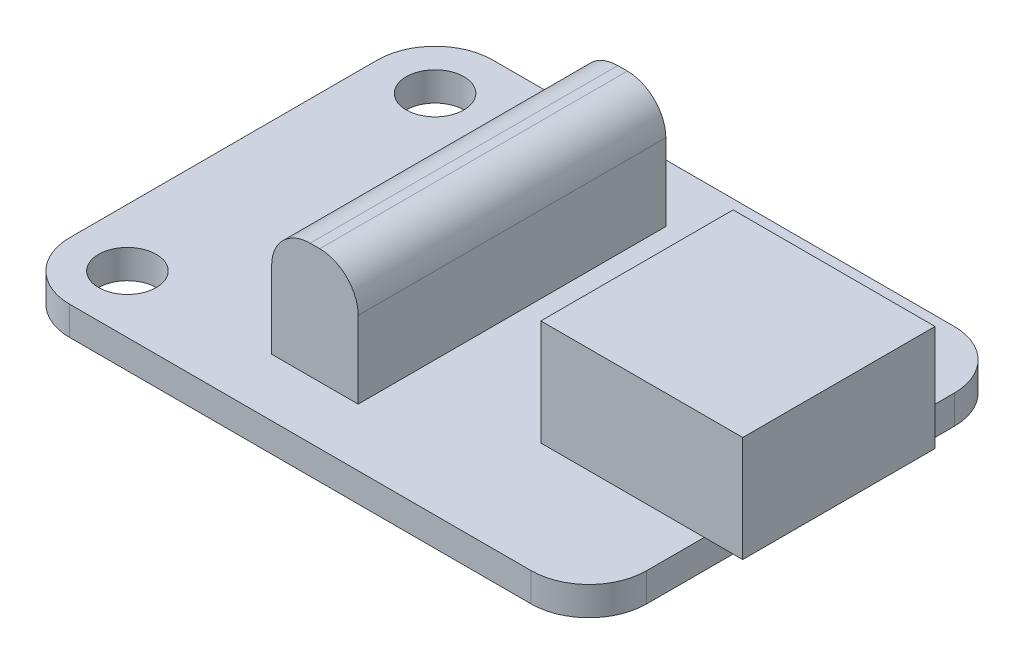
ISO-10303-21;
HEADER;
FILE_DESCRIPTION(('STEP AP214'),'2;1');
FILE_NAME('part.step','',(''),(''),'','','');
FILE_SCHEMA(('AUTOMOTIVE_DESIGN { 1 0 10303 214 1 1 1 1 }'));
ENDSEC;
DATA;
#1=APPLICATION_CONTEXT('core data for automotive mechanical design processes');
#2=APPLICATION_PROTOCOL_DEFINITION('international standard','automotive_design',2000,#1);
#3=PRODUCT_CONTEXT('',#1,'mechanical');
#4=PRODUCT('Part','Part','',(#3));
#5=PRODUCT_RELATED_PRODUCT_CATEGORY('part','',(#4));
#6=PRODUCT_DEFINITION_FORMATION('','',#4);
#7=PRODUCT_DEFINITION_CONTEXT('part definition',#1,'design');
#8=PRODUCT_DEFINITION('design','',#6,#7);
#9=PRODUCT_DEFINITION_SHAPE('','',#8);
#10=(LENGTH_UNIT() NAMED_UNIT(*) SI_UNIT(.MILLI.,.METRE.));
#11=(NAMED_UNIT(*) PLANE_ANGLE_UNIT() SI_UNIT($,.RADIAN.));
#12=(NAMED_UNIT(*) SI_UNIT($,.STERADIAN.) SOLID_ANGLE_UNIT());
#13=UNCERTAINTY_MEASURE_WITH_UNIT(LENGTH_MEASURE(1.E-05),#10,'distance_accuracy_value','');
#14=(GEOMETRIC_REPRESENTATION_CONTEXT(3) GLOBAL_UNCERTAINTY_ASSIGNED_CONTEXT((#13)) GLOBAL_UNIT_ASSIGNED_CONTEXT((#10,
#11,#12)) REPRESENTATION_CONTEXT('',''));
#15=CARTESIAN_POINT('',(0.,0.,0.));
#16=DIRECTION('',(0.,0.,1.));
#17=DIRECTION('',(1.,0.,0.));
#18=AXIS2_PLACEMENT_3D('',#15,#16,#17);
#19=CARTESIAN_POINT('',(-1.19831368631368,1.5,13.1654125874126));
#20=DIRECTION('',(0.,-1.,0.));
#21=DIRECTION('',(0.,0.,-1.));
#22=AXIS2_PLACEMENT_3D('',#19,#20,#21);
#23=PLANE('',#22);
#24=DIRECTION('',(-1.,0.,0.));
#25=VECTOR('',#24,1.);
#26=CARTESIAN_POINT('',(1.80168631368632,1.5,0.165412587412595));
#27=LINE('',#26,#25);
#28=CARTESIAN_POINT('',(1.80168631368632,1.5,0.165412587412596));
#29=VERTEX_POINT('',#28);
#30=CARTESIAN_POINT('',(-6.69831368631368,1.5,0.165412587412596));
#31=VERTEX_POINT('',#30);
#32=EDGE_CURVE('E211',#29,#31,#27,.T.);
#33=ORIENTED_EDGE('',*,*,#32,.F.);
#34=DIRECTION('',(0.,0.,-1.));
#35=VECTOR('',#34,1.);
#36=CARTESIAN_POINT('',(1.80168631368632,1.5,-2.83458741258738));
#37=LINE('',#36,#35);
#38=CARTESIAN_POINT('',(1.80168631368632,1.5,-2.83458741258738));
#39=VERTEX_POINT('',#38);
#40=EDGE_CURVE('E247',#29,#39,#37,.T.);
#41=ORIENTED_EDGE('',*,*,#40,.T.);
#42=CARTESIAN_POINT('',(-1.19831368631368,1.5,-2.8345874125874));
#43=DIRECTION('',(0.,1.,0.));
#44=DIRECTION('',(0.,0.,1.));
#45=AXIS2_PLACEMENT_3D('',#42,#43,#44);
#46=CIRCLE('',#45,3.);
#47=CARTESIAN_POINT('',(-1.1983136863137,1.5,-5.8345874125874));
#48=VERTEX_POINT('',#47);
#49=EDGE_CURVE('E252',#39,#48,#46,.T.);
#50=ORIENTED_EDGE('',*,*,#49,.T.);
#51=DIRECTION('',(-1.,0.,0.));
#52=VECTOR('',#51,1.);
#53=CARTESIAN_POINT('',(-25.1983136863137,1.5,-5.8345874125874));
#54=LINE('',#53,#52);
#55=CARTESIAN_POINT('',(-25.1983136863137,1.5,-5.8345874125874));
#56=VERTEX_POINT('',#55);
#57=EDGE_CURVE('E255',#48,#56,#54,.T.);
#58=ORIENTED_EDGE('',*,*,#57,.T.);
#59=CARTESIAN_POINT('',(-25.1983136863137,1.5,-2.8345874125874));
#60=DIRECTION('',(0.,1.,0.));
#61=DIRECTION('',(0.,0.,1.));
#62=AXIS2_PLACEMENT_3D('',#59,#60,#61);
#63=CIRCLE('',#62,3.);
#64=CARTESIAN_POINT('',(-28.1983136863137,1.5,-2.83458741258738));
#65=VERTEX_POINT('',#64);
#66=EDGE_CURVE('E257',#56,#65,#63,.T.);
#67=ORIENTED_EDGE('',*,*,#66,.T.);
#68=DIRECTION('',(0.,0.,1.));
#69=VECTOR('',#68,1.);
#70=CARTESIAN_POINT('',(-28.1983136863137,1.5,-2.83458741258738));
#71=LINE('',#70,#69);
#72=CARTESIAN_POINT('',(-28.1983136863137,1.5,13.1654125874126));
#73=VERTEX_POINT('',#72);
#74=EDGE_CURVE('E259',#65,#73,#71,.T.);
#75=ORIENTED_EDGE('',*,*,#74,.T.);
#76=CARTESIAN_POINT('',(-25.1983136863137,1.5,13.1654125874126));
#77=DIRECTION('',(0.,1.,0.));
#78=DIRECTION('',(0.,0.,-1.));
#79=AXIS2_PLACEMENT_3D('',#76,#77,#78);
#80=CIRCLE('',#79,3.);
#81=CARTESIAN_POINT('',(-25.1983136863137,1.5,16.1654125874126));
#82=VERTEX_POINT('',#81);
#83=EDGE_CURVE('E261',#73,#82,#80,.T.);
#84=ORIENTED_EDGE('',*,*,#83,.T.);
#85=DIRECTION('',(1.,0.,0.));
#86=VECTOR('',#85,1.);
#87=CARTESIAN_POINT('',(-1.1983136863137,1.5,16.1654125874126));
#88=LINE('',#87,#86);
#89=CARTESIAN_POINT('',(-1.1983136863137,1.5,16.1654125874126));
#90=VERTEX_POINT('',#89);
#91=EDGE_CURVE('E263',#82,#90,#88,.T.);
#92=ORIENTED_EDGE('',*,*,#91,.T.);
#93=CARTESIAN_POINT('',(-1.19831368631368,1.5,13.1654125874126));
#94=DIRECTION('',(0.,1.,0.));
#95=DIRECTION('',(0.,0.,-1.));
#96=AXIS2_PLACEMENT_3D('',#93,#94,#95);
#97=CIRCLE('',#96,3.);
#98=CARTESIAN_POINT('',(1.80168631368632,1.5,13.1654125874126));
#99=VERTEX_POINT('',#98);
#100=EDGE_CURVE('E244',#90,#99,#97,.T.);
#101=ORIENTED_EDGE('',*,*,#100,.T.);
#102=CARTESIAN_POINT('',(1.80168631368632,1.5,10.1654125874126));
#103=VERTEX_POINT('',#102);
#104=EDGE_CURVE('E249',#99,#103,#37,.T.);
#105=ORIENTED_EDGE('',*,*,#104,.T.);
#106=DIRECTION('',(1.,0.,0.));
#107=VECTOR('',#106,1.);
#108=CARTESIAN_POINT('',(1.80168631368632,1.5,10.1654125874126));
#109=LINE('',#108,#107);
#110=CARTESIAN_POINT('',(-6.69831368631368,1.5,10.1654125874126));
#111=VERTEX_POINT('',#110);
#112=EDGE_CURVE('E215',#111,#103,#109,.T.);
#113=ORIENTED_EDGE('',*,*,#112,.F.);
#114=DIRECTION('',(0.,0.,1.));
#115=VECTOR('',#114,1.);
#116=CARTESIAN_POINT('',(-6.69831368631368,1.5,0.165412587412596));
#117=LINE('',#116,#115);
#118=EDGE_CURVE('E210',#31,#111,#117,.T.);
#119=ORIENTED_EDGE('',*,*,#118,.F.);
#120=EDGE_LOOP('',(#33,#41,#50,#58,#67,#75,#84,#92,#101,#105,#113,#119));
#121=FACE_BOUND('',#120,.T.);
#122=CARTESIAN_POINT('',(-25.1983136863137,1.5,13.1654125874126));
#123=DIRECTION('',(0.,1.,0.));
#124=DIRECTION('',(0.,0.,1.));
#125=AXIS2_PLACEMENT_3D('',#122,#123,#124);
#126=CIRCLE('',#125,1.5);
#127=CARTESIAN_POINT('',(-25.1983136863137,1.5,14.6654125874126));
#128=VERTEX_POINT('',#127);
#129=EDGE_CURVE('E238',#128,#128,#126,.T.);
#130=ORIENTED_EDGE('',*,*,#129,.F.);
#131=EDGE_LOOP('',(#130));
#132=FACE_BOUND('',#131,.T.);
#133=CARTESIAN_POINT('',(-25.1983136863137,1.5,-2.8345874125874));
#134=DIRECTION('',(0.,1.,0.));
#135=DIRECTION('',(0.,0.,1.));
#136=AXIS2_PLACEMENT_3D('',#133,#134,#135);
#137=CIRCLE('',#136,1.5);
#138=CARTESIAN_POINT('',(-25.1983136863137,1.5,-1.3345874125874));
#139=VERTEX_POINT('',#138);
#140=EDGE_CURVE('E232',#139,#139,#137,.T.);
#141=ORIENTED_EDGE('',*,*,#140,.F.);
#142=EDGE_LOOP('',(#141));
#143=FACE_BOUND('',#142,.T.);
#144=DIRECTION('',(-1.,0.,0.));
#145=VECTOR('',#144,1.);
#146=CARTESIAN_POINT('',(-13.1983136863137,1.5,-2.8345874125874));
#147=LINE('',#146,#145);
#148=CARTESIAN_POINT('',(-13.1983136863137,1.5,-2.8345874125874));
#149=VERTEX_POINT('',#148);
#150=CARTESIAN_POINT('',(-17.6983136863137,1.5,-2.8345874125874));
#151=VERTEX_POINT('',#150);
#152=EDGE_CURVE('E166',#149,#151,#147,.T.);
#153=ORIENTED_EDGE('',*,*,#152,.F.);
#154=DIRECTION('',(0.,0.,-1.));
#155=VECTOR('',#154,1.);
#156=CARTESIAN_POINT('',(-13.1983136863137,1.5,13.1654125874126));
#157=LINE('',#156,#155);
#158=CARTESIAN_POINT('',(-13.1983136863137,1.5,13.1654125874126));
#159=VERTEX_POINT('',#158);
#160=EDGE_CURVE('E177',#159,#149,#157,.T.);
#161=ORIENTED_EDGE('',*,*,#160,.F.);
#162=DIRECTION('',(1.,0.,0.));
#163=VECTOR('',#162,1.);
#164=CARTESIAN_POINT('',(-17.6983136863137,1.5,13.1654125874126));
#165=LINE('',#164,#163);
#166=CARTESIAN_POINT('',(-17.6983136863137,1.5,13.1654125874126));
#167=VERTEX_POINT('',#166);
#168=EDGE_CURVE('E185',#167,#159,#165,.T.);
#169=ORIENTED_EDGE('',*,*,#168,.F.);
#170=DIRECTION('',(0.,0.,1.));
#171=VECTOR('',#170,1.);
#172=CARTESIAN_POINT('',(-17.6983136863137,1.5,-2.8345874125874));
#173=LINE('',#172,#171);
#174=EDGE_CURVE('E180',#151,#167,#173,.T.);
#175=ORIENTED_EDGE('',*,*,#174,.F.);
#176=EDGE_LOOP('',(#153,#161,#169,#175));
#177=FACE_BOUND('',#176,.T.);
#178=ADVANCED_FACE('F34',(#121,#132,#143,#177),#23,.F.);
#179=CARTESIAN_POINT('',(-1.19831368631368,0.,13.1654125874126));
#180=DIRECTION('',(0.,-1.,0.));
#181=DIRECTION('',(0.,0.,-1.));
#182=AXIS2_PLACEMENT_3D('',#179,#180,#181);
#183=PLANE('',#182);
#184=CARTESIAN_POINT('',(-25.1983136863137,0.,13.1654125874126));
#185=DIRECTION('',(0.,1.,0.));
#186=DIRECTION('',(0.,0.,1.));
#187=AXIS2_PLACEMENT_3D('',#184,#185,#186);
#188=CIRCLE('',#187,1.5);
#189=CARTESIAN_POINT('',(-25.1983136863137,0.,14.6654125874126));
#190=VERTEX_POINT('',#189);
#191=EDGE_CURVE('E235',#190,#190,#188,.T.);
#192=ORIENTED_EDGE('',*,*,#191,.T.);
#193=EDGE_LOOP('',(#192));
#194=FACE_BOUND('',#193,.T.);
#195=CARTESIAN_POINT('',(-1.19831368631368,0.,13.1654125874126));
#196=DIRECTION('',(0.,1.,0.));
#197=DIRECTION('',(0.,0.,-1.));
#198=AXIS2_PLACEMENT_3D('',#195,#196,#197);
#199=CIRCLE('',#198,3.);
#200=CARTESIAN_POINT('',(-1.1983136863137,0.,16.1654125874126));
#201=VERTEX_POINT('',#200);
#202=CARTESIAN_POINT('',(1.80168631368632,0.,13.1654125874126));
#203=VERTEX_POINT('',#202);
#204=EDGE_CURVE('E241',#201,#203,#199,.T.);
#205=ORIENTED_EDGE('',*,*,#204,.F.);
#206=DIRECTION('',(1.,0.,0.));
#207=VECTOR('',#206,1.);
#208=CARTESIAN_POINT('',(-1.1983136863137,0.,16.1654125874126));
#209=LINE('',#208,#207);
#210=CARTESIAN_POINT('',(-25.1983136863137,0.,16.1654125874126));
#211=VERTEX_POINT('',#210);
#212=EDGE_CURVE('E248',#211,#201,#209,.T.);
#213=ORIENTED_EDGE('',*,*,#212,.F.);
#214=CARTESIAN_POINT('',(-25.1983136863137,0.,13.1654125874126));
#215=DIRECTION('',(0.,1.,0.));
#216=DIRECTION('',(0.,0.,-1.));
#217=AXIS2_PLACEMENT_3D('',#214,#215,#216);
#218=CIRCLE('',#217,3.);
#219=CARTESIAN_POINT('',(-28.1983136863137,0.,13.1654125874126));
#220=VERTEX_POINT('',#219);
#221=EDGE_CURVE('E278',#220,#211,#218,.T.);
#222=ORIENTED_EDGE('',*,*,#221,.F.);
#223=DIRECTION('',(0.,0.,1.));
#224=VECTOR('',#223,1.);
#225=CARTESIAN_POINT('',(-28.1983136863137,0.,-2.83458741258738));
#226=LINE('',#225,#224);
#227=CARTESIAN_POINT('',(-28.1983136863137,0.,-2.83458741258738));
#228=VERTEX_POINT('',#227);
#229=EDGE_CURVE('E276',#228,#220,#226,.T.);
#230=ORIENTED_EDGE('',*,*,#229,.F.);
#231=CARTESIAN_POINT('',(-25.1983136863137,0.,-2.8345874125874));
#232=DIRECTION('',(0.,1.,0.));
#233=DIRECTION('',(0.,0.,1.));
#234=AXIS2_PLACEMENT_3D('',#231,#232,#233);
#235=CIRCLE('',#234,3.);
#236=CARTESIAN_POINT('',(-25.1983136863137,0.,-5.8345874125874));
#237=VERTEX_POINT('',#236);
#238=EDGE_CURVE('E274',#237,#228,#235,.T.);
#239=ORIENTED_EDGE('',*,*,#238,.F.);
#240=DIRECTION('',(-1.,0.,0.));
#241=VECTOR('',#240,1.);
#242=CARTESIAN_POINT('',(-25.1983136863137,0.,-5.8345874125874));
#243=LINE('',#242,#241);
#244=CARTESIAN_POINT('',(-1.1983136863137,0.,-5.8345874125874));
#245=VERTEX_POINT('',#244);
#246=EDGE_CURVE('E272',#245,#237,#243,.T.);
#247=ORIENTED_EDGE('',*,*,#246,.F.);
#248=CARTESIAN_POINT('',(-1.19831368631368,0.,-2.8345874125874));
#249=DIRECTION('',(0.,1.,0.));
#250=DIRECTION('',(0.,0.,1.));
#251=AXIS2_PLACEMENT_3D('',#248,#249,#250);
#252=CIRCLE('',#251,3.);
#253=CARTESIAN_POINT('',(1.80168631368632,0.,-2.83458741258738));
#254=VERTEX_POINT('',#253);
#255=EDGE_CURVE('E270',#254,#245,#252,.T.);
#256=ORIENTED_EDGE('',*,*,#255,.F.);
#257=DIRECTION('',(0.,0.,-1.));
#258=VECTOR('',#257,1.);
#259=CARTESIAN_POINT('',(1.80168631368632,0.,-2.83458741258738));
#260=LINE('',#259,#258);
#261=EDGE_CURVE('E268',#203,#254,#260,.T.);
#262=ORIENTED_EDGE('',*,*,#261,.F.);
#263=EDGE_LOOP('',(#205,#213,#222,#230,#239,#247,#256,#262));
#264=FACE_BOUND('',#263,.T.);
#265=CARTESIAN_POINT('',(-25.1983136863137,0.,-2.8345874125874));
#266=DIRECTION('',(0.,1.,0.));
#267=DIRECTION('',(0.,0.,1.));
#268=AXIS2_PLACEMENT_3D('',#265,#266,#267);
#269=CIRCLE('',#268,1.5);
#270=CARTESIAN_POINT('',(-25.1983136863137,0.,-1.3345874125874));
#271=VERTEX_POINT('',#270);
#272=EDGE_CURVE('E231',#271,#271,#269,.T.);
#273=ORIENTED_EDGE('',*,*,#272,.T.);
#274=EDGE_LOOP('',(#273));
#275=FACE_BOUND('',#274,.T.);
#276=ADVANCED_FACE('F335',(#194,#264,#275),#183,.T.);
#277=CARTESIAN_POINT('',(-1.19831368631368,1.5,13.1654125874126));
#278=DIRECTION('',(0.,-1.,0.));
#279=DIRECTION('',(0.,0.,-1.));
#280=AXIS2_PLACEMENT_3D('',#277,#278,#279);
#281=CYLINDRICAL_SURFACE('',#280,3.);
#282=ORIENTED_EDGE('',*,*,#204,.T.);
#283=DIRECTION('',(0.,-1.,0.));
#284=VECTOR('',#283,1.);
#285=CARTESIAN_POINT('',(1.80168631368632,1.5,13.1654125874126));
#286=LINE('',#285,#284);
#287=EDGE_CURVE('E301',#99,#203,#286,.T.);
#288=ORIENTED_EDGE('',*,*,#287,.F.);
#289=ORIENTED_EDGE('',*,*,#100,.F.);
#290=DIRECTION('',(0.,-1.,0.));
#291=VECTOR('',#290,1.);
#292=CARTESIAN_POINT('',(-1.1983136863137,1.5,16.1654125874126));
#293=LINE('',#292,#291);
#294=EDGE_CURVE('E265',#90,#201,#293,.T.);
#295=ORIENTED_EDGE('',*,*,#294,.T.);
#296=EDGE_LOOP('',(#282,#288,#289,#295));
#297=FACE_BOUND('',#296,.T.);
#298=ADVANCED_FACE('F341',(#297),#281,.T.);
#299=CARTESIAN_POINT('',(1.80168631368632,1.5,-2.83458741258738));
#300=DIRECTION('',(-1.,0.,0.));
#301=DIRECTION('',(0.,0.,1.));
#302=AXIS2_PLACEMENT_3D('',#299,#300,#301);
#303=PLANE('',#302);
#304=ORIENTED_EDGE('',*,*,#261,.T.);
#305=DIRECTION('',(0.,-1.,0.));
#306=VECTOR('',#305,1.);
#307=CARTESIAN_POINT('',(1.80168631368632,1.5,-2.83458741258738));
#308=LINE('',#307,#306);
#309=EDGE_CURVE('E298',#39,#254,#308,.T.);
#310=ORIENTED_EDGE('',*,*,#309,.F.);
#311=ORIENTED_EDGE('',*,*,#40,.F.);
#312=EDGE_CURVE('E253',#103,#29,#37,.T.);
#313=ORIENTED_EDGE('',*,*,#312,.F.);
#314=ORIENTED_EDGE('',*,*,#104,.F.);
#315=ORIENTED_EDGE('',*,*,#287,.T.);
#316=EDGE_LOOP('',(#304,#310,#311,#313,#314,#315));
#317=FACE_BOUND('',#316,.T.);
#318=ADVANCED_FACE('F372',(#317),#303,.F.);
#319=CARTESIAN_POINT('',(-1.19831368631368,1.5,-2.8345874125874));
#320=DIRECTION('',(0.,-1.,0.));
#321=DIRECTION('',(0.,0.,-1.));
#322=AXIS2_PLACEMENT_3D('',#319,#320,#321);
#323=CYLINDRICAL_SURFACE('',#322,3.);
#324=ORIENTED_EDGE('',*,*,#255,.T.);
#325=DIRECTION('',(0.,-1.,0.));
#326=VECTOR('',#325,1.);
#327=CARTESIAN_POINT('',(-1.1983136863137,1.5,-5.8345874125874));
#328=LINE('',#327,#326);
#329=EDGE_CURVE('E295',#48,#245,#328,.T.);
#330=ORIENTED_EDGE('',*,*,#329,.F.);
#331=ORIENTED_EDGE('',*,*,#49,.F.);
#332=ORIENTED_EDGE('',*,*,#309,.T.);
#333=EDGE_LOOP('',(#324,#330,#331,#332));
#334=FACE_BOUND('',#333,.T.);
#335=ADVANCED_FACE('F368',(#334),#323,.T.);
#336=CARTESIAN_POINT('',(-25.1983136863137,1.5,-5.8345874125874));
#337=DIRECTION('',(0.,0.,1.));
#338=DIRECTION('',(1.,0.,0.));
#339=AXIS2_PLACEMENT_3D('',#336,#337,#338);
#340=PLANE('',#339);
#341=ORIENTED_EDGE('',*,*,#246,.T.);
#342=DIRECTION('',(0.,-1.,0.));
#343=VECTOR('',#342,1.);
#344=CARTESIAN_POINT('',(-25.1983136863137,1.5,-5.8345874125874));
#345=LINE('',#344,#343);
#346=EDGE_CURVE('E292',#56,#237,#345,.T.);
#347=ORIENTED_EDGE('',*,*,#346,.F.);
#348=ORIENTED_EDGE('',*,*,#57,.F.);
#349=ORIENTED_EDGE('',*,*,#329,.T.);
#350=EDGE_LOOP('',(#341,#347,#348,#349));
#351=FACE_BOUND('',#350,.T.);
#352=ADVANCED_FACE('F364',(#351),#340,.F.);
#353=CARTESIAN_POINT('',(-25.1983136863137,1.5,-2.8345874125874));
#354=DIRECTION('',(0.,-1.,0.));
#355=DIRECTION('',(0.,0.,-1.));
#356=AXIS2_PLACEMENT_3D('',#353,#354,#355);
#357=CYLINDRICAL_SURFACE('',#356,3.);
#358=ORIENTED_EDGE('',*,*,#238,.T.);
#359=DIRECTION('',(0.,-1.,0.));
#360=VECTOR('',#359,1.);
#361=CARTESIAN_POINT('',(-28.1983136863137,1.5,-2.83458741258738));
#362=LINE('',#361,#360);
#363=EDGE_CURVE('E289',#65,#228,#362,.T.);
#364=ORIENTED_EDGE('',*,*,#363,.F.);
#365=ORIENTED_EDGE('',*,*,#66,.F.);
#366=ORIENTED_EDGE('',*,*,#346,.T.);
#367=EDGE_LOOP('',(#358,#364,#365,#366));
#368=FACE_BOUND('',#367,.T.);
#369=ADVANCED_FACE('F360',(#368),#357,.T.);
#370=CARTESIAN_POINT('',(-28.1983136863137,1.5,-2.83458741258738));
#371=DIRECTION('',(1.,0.,0.));
#372=DIRECTION('',(0.,0.,-1.));
#373=AXIS2_PLACEMENT_3D('',#370,#371,#372);
#374=PLANE('',#373);
#375=ORIENTED_EDGE('',*,*,#229,.T.);
#376=DIRECTION('',(0.,-1.,0.));
#377=VECTOR('',#376,1.);
#378=CARTESIAN_POINT('',(-28.1983136863137,1.5,13.1654125874126));
#379=LINE('',#378,#377);
#380=EDGE_CURVE('E286',#73,#220,#379,.T.);
#381=ORIENTED_EDGE('',*,*,#380,.F.);
#382=ORIENTED_EDGE('',*,*,#74,.F.);
#383=ORIENTED_EDGE('',*,*,#363,.T.);
#384=EDGE_LOOP('',(#375,#381,#382,#383));
#385=FACE_BOUND('',#384,.T.);
#386=ADVANCED_FACE('F356',(#385),#374,.F.);
#387=CARTESIAN_POINT('',(-25.1983136863137,1.5,13.1654125874126));
#388=DIRECTION('',(0.,-1.,0.));
#389=DIRECTION('',(0.,0.,-1.));
#390=AXIS2_PLACEMENT_3D('',#387,#388,#389);
#391=CYLINDRICAL_SURFACE('',#390,3.);
#392=ORIENTED_EDGE('',*,*,#221,.T.);
#393=DIRECTION('',(0.,-1.,0.));
#394=VECTOR('',#393,1.);
#395=CARTESIAN_POINT('',(-25.1983136863137,1.5,16.1654125874126));
#396=LINE('',#395,#394);
#397=EDGE_CURVE('E283',#82,#211,#396,.T.);
#398=ORIENTED_EDGE('',*,*,#397,.F.);
#399=ORIENTED_EDGE('',*,*,#83,.F.);
#400=ORIENTED_EDGE('',*,*,#380,.T.);
#401=EDGE_LOOP('',(#392,#398,#399,#400));
#402=FACE_BOUND('',#401,.T.);
#403=ADVANCED_FACE('F352',(#402),#391,.T.);
#404=CARTESIAN_POINT('',(-1.1983136863137,1.5,16.1654125874126));
#405=DIRECTION('',(0.,0.,-1.));
#406=DIRECTION('',(-1.,0.,0.));
#407=AXIS2_PLACEMENT_3D('',#404,#405,#406);
#408=PLANE('',#407);
#409=ORIENTED_EDGE('',*,*,#212,.T.);
#410=ORIENTED_EDGE('',*,*,#294,.F.);
#411=ORIENTED_EDGE('',*,*,#91,.F.);
#412=ORIENTED_EDGE('',*,*,#397,.T.);
#413=EDGE_LOOP('',(#409,#410,#411,#412));
#414=FACE_BOUND('',#413,.T.);
#415=ADVANCED_FACE('F349',(#414),#408,.F.);
#416=CARTESIAN_POINT('',(-25.1983136863137,1.5,13.1654125874126));
#417=DIRECTION('',(0.,-1.,0.));
#418=DIRECTION('',(0.,0.,-1.));
#419=AXIS2_PLACEMENT_3D('',#416,#417,#418);
#420=CYLINDRICAL_SURFACE('',#419,1.5);
#421=ORIENTED_EDGE('',*,*,#129,.T.);
#422=EDGE_LOOP('',(#421));
#423=FACE_BOUND('',#422,.T.);
#424=ORIENTED_EDGE('',*,*,#191,.F.);
#425=EDGE_LOOP('',(#424));
#426=FACE_BOUND('',#425,.T.);
#427=ADVANCED_FACE('F346',(#423,#426),#420,.F.);
#428=CARTESIAN_POINT('',(-25.1983136863137,1.5,-2.8345874125874));
#429=DIRECTION('',(0.,-1.,0.));
#430=DIRECTION('',(0.,0.,-1.));
#431=AXIS2_PLACEMENT_3D('',#428,#429,#430);
#432=CYLINDRICAL_SURFACE('',#431,1.5);
#433=ORIENTED_EDGE('',*,*,#140,.T.);
#434=EDGE_LOOP('',(#433));
#435=FACE_BOUND('',#434,.T.);
#436=ORIENTED_EDGE('',*,*,#272,.F.);
#437=EDGE_LOOP('',(#436));
#438=FACE_BOUND('',#437,.T.);
#439=ADVANCED_FACE('F441',(#435,#438),#432,.F.);
#440=CARTESIAN_POINT('',(0.,1.5,0.));
#441=DIRECTION('',(0.,1.,0.));
#442=DIRECTION('',(0.,0.,1.));
#443=AXIS2_PLACEMENT_3D('',#440,#441,#442);
#444=PLANE('',#443);
#445=CARTESIAN_POINT('',(3.80168631368632,1.5,10.1654125874126));
#446=VERTEX_POINT('',#445);
#447=EDGE_CURVE('E214',#103,#446,#109,.T.);
#448=ORIENTED_EDGE('',*,*,#447,.F.);
#449=ORIENTED_EDGE('',*,*,#312,.T.);
#450=CARTESIAN_POINT('',(3.80168631368632,1.5,0.165412587412595));
#451=VERTEX_POINT('',#450);
#452=EDGE_CURVE('E197',#451,#29,#27,.T.);
#453=ORIENTED_EDGE('',*,*,#452,.F.);
#454=DIRECTION('',(0.,0.,-1.));
#455=VECTOR('',#454,1.);
#456=CARTESIAN_POINT('',(3.80168631368632,1.5,10.1654125874126));
#457=LINE('',#456,#455);
#458=EDGE_CURVE('E201',#446,#451,#457,.T.);
#459=ORIENTED_EDGE('',*,*,#458,.F.);
#460=EDGE_LOOP('',(#448,#449,#453,#459));
#461=FACE_BOUND('',#460,.T.);
#462=ADVANCED_FACE('F409',(#461),#444,.F.);
#463=CARTESIAN_POINT('',(1.80168631368632,7.,0.165412587412595));
#464=DIRECTION('',(0.,0.,1.));
#465=DIRECTION('',(1.,0.,0.));
#466=AXIS2_PLACEMENT_3D('',#463,#464,#465);
#467=PLANE('',#466);
#468=ORIENTED_EDGE('',*,*,#452,.T.);
#469=ORIENTED_EDGE('',*,*,#32,.T.);
#470=DIRECTION('',(0.,-1.,0.));
#471=VECTOR('',#470,1.);
#472=CARTESIAN_POINT('',(-6.69831368631368,7.,0.165412587412596));
#473=LINE('',#472,#471);
#474=CARTESIAN_POINT('',(-6.69831368631368,7.,0.165412587412596));
#475=VERTEX_POINT('',#474);
#476=EDGE_CURVE('E228',#475,#31,#473,.T.);
#477=ORIENTED_EDGE('',*,*,#476,.F.);
#478=DIRECTION('',(-1.,0.,0.));
#479=VECTOR('',#478,1.);
#480=CARTESIAN_POINT('',(3.80168631368632,7.,0.165412587412595));
#481=LINE('',#480,#479);
#482=CARTESIAN_POINT('',(3.80168631368632,7.,0.165412587412595));
#483=VERTEX_POINT('',#482);
#484=EDGE_CURVE('E198',#483,#475,#481,.T.);
#485=ORIENTED_EDGE('',*,*,#484,.F.);
#486=DIRECTION('',(0.,-1.,0.));
#487=VECTOR('',#486,1.);
#488=CARTESIAN_POINT('',(3.80168631368632,7.,0.165412587412595));
#489=LINE('',#488,#487);
#490=EDGE_CURVE('E207',#483,#451,#489,.T.);
#491=ORIENTED_EDGE('',*,*,#490,.T.);
#492=EDGE_LOOP('',(#468,#469,#477,#485,#491));
#493=FACE_BOUND('',#492,.T.);
#494=ADVANCED_FACE('F413',(#493),#467,.F.);
#495=CARTESIAN_POINT('',(-6.69831368631368,7.,0.165412587412596));
#496=DIRECTION('',(1.,0.,0.));
#497=DIRECTION('',(0.,0.,-1.));
#498=AXIS2_PLACEMENT_3D('',#495,#496,#497);
#499=PLANE('',#498);
#500=ORIENTED_EDGE('',*,*,#118,.T.);
#501=DIRECTION('',(0.,-1.,0.));
#502=VECTOR('',#501,1.);
#503=CARTESIAN_POINT('',(-6.69831368631368,7.,10.1654125874126));
#504=LINE('',#503,#502);
#505=CARTESIAN_POINT('',(-6.69831368631368,7.,10.1654125874126));
#506=VERTEX_POINT('',#505);
#507=EDGE_CURVE('E225',#506,#111,#504,.T.);
#508=ORIENTED_EDGE('',*,*,#507,.F.);
#509=DIRECTION('',(0.,0.,1.));
#510=VECTOR('',#509,1.);
#511=CARTESIAN_POINT('',(-6.69831368631368,7.,0.165412587412596));
#512=LINE('',#511,#510);
#513=EDGE_CURVE('E200',#475,#506,#512,.T.);
#514=ORIENTED_EDGE('',*,*,#513,.F.);
#515=ORIENTED_EDGE('',*,*,#476,.T.);
#516=EDGE_LOOP('',(#500,#508,#514,#515));
#517=FACE_BOUND('',#516,.T.);
#518=ADVANCED_FACE('F426',(#517),#499,.F.);
#519=CARTESIAN_POINT('',(1.80168631368632,7.,10.1654125874126));
#520=DIRECTION('',(0.,0.,-1.));
#521=DIRECTION('',(-1.,0.,0.));
#522=AXIS2_PLACEMENT_3D('',#519,#520,#521);
#523=PLANE('',#522);
#524=ORIENTED_EDGE('',*,*,#112,.T.);
#525=ORIENTED_EDGE('',*,*,#447,.T.);
#526=DIRECTION('',(0.,-1.,0.));
#527=VECTOR('',#526,1.);
#528=CARTESIAN_POINT('',(3.80168631368632,7.,10.1654125874126));
#529=LINE('',#528,#527);
#530=CARTESIAN_POINT('',(3.80168631368632,7.,10.1654125874126));
#531=VERTEX_POINT('',#530);
#532=EDGE_CURVE('E222',#531,#446,#529,.T.);
#533=ORIENTED_EDGE('',*,*,#532,.F.);
#534=DIRECTION('',(1.,0.,0.));
#535=VECTOR('',#534,1.);
#536=CARTESIAN_POINT('',(1.80168631368632,7.,10.1654125874126));
#537=LINE('',#536,#535);
#538=EDGE_CURVE('E203',#506,#531,#537,.T.);
#539=ORIENTED_EDGE('',*,*,#538,.F.);
#540=ORIENTED_EDGE('',*,*,#507,.T.);
#541=EDGE_LOOP('',(#524,#525,#533,#539,#540));
#542=FACE_BOUND('',#541,.T.);
#543=ADVANCED_FACE('F423',(#542),#523,.F.);
#544=CARTESIAN_POINT('',(3.80168631368632,7.,10.1654125874126));
#545=DIRECTION('',(-1.,0.,0.));
#546=DIRECTION('',(0.,0.,1.));
#547=AXIS2_PLACEMENT_3D('',#544,#545,#546);
#548=PLANE('',#547);
#549=ORIENTED_EDGE('',*,*,#458,.T.);
#550=ORIENTED_EDGE('',*,*,#490,.F.);
#551=DIRECTION('',(0.,0.,-1.));
#552=VECTOR('',#551,1.);
#553=CARTESIAN_POINT('',(3.80168631368632,7.,10.1654125874126));
#554=LINE('',#553,#552);
#555=EDGE_CURVE('E205',#531,#483,#554,.T.);
#556=ORIENTED_EDGE('',*,*,#555,.F.);
#557=ORIENTED_EDGE('',*,*,#532,.T.);
#558=EDGE_LOOP('',(#549,#550,#556,#557));
#559=FACE_BOUND('',#558,.T.);
#560=ADVANCED_FACE('F419',(#559),#548,.F.);
#561=CARTESIAN_POINT('',(0.,7.,0.));
#562=DIRECTION('',(0.,1.,0.));
#563=DIRECTION('',(0.,0.,1.));
#564=AXIS2_PLACEMENT_3D('',#561,#562,#563);
#565=PLANE('',#564);
#566=ORIENTED_EDGE('',*,*,#484,.T.);
#567=ORIENTED_EDGE('',*,*,#513,.T.);
#568=ORIENTED_EDGE('',*,*,#538,.T.);
#569=ORIENTED_EDGE('',*,*,#555,.T.);
#570=EDGE_LOOP('',(#566,#567,#568,#569));
#571=FACE_BOUND('',#570,.T.);
#572=ADVANCED_FACE('F429',(#571),#565,.T.);
#573=CARTESIAN_POINT('',(-13.1983136863137,7.5,-2.8345874125874));
#574=DIRECTION('',(0.,0.,1.));
#575=DIRECTION('',(1.,0.,0.));
#576=AXIS2_PLACEMENT_3D('',#573,#574,#575);
#577=PLANE('',#576);
#578=DIRECTION('',(0.,-1.,0.));
#579=VECTOR('',#578,1.);
#580=CARTESIAN_POINT('',(-17.6983136863137,7.5,-2.8345874125874));
#581=LINE('',#580,#579);
#582=CARTESIAN_POINT('',(-17.6983136863137,5.5,-2.8345874125874));
#583=VERTEX_POINT('',#582);
#584=EDGE_CURVE('E195',#583,#151,#581,.T.);
#585=ORIENTED_EDGE('',*,*,#584,.F.);
#586=CARTESIAN_POINT('',(-15.6983136863137,5.5,-2.8345874125874));
#587=DIRECTION('',(0.,0.,1.));
#588=DIRECTION('',(1.,0.,0.));
#589=AXIS2_PLACEMENT_3D('',#586,#587,#588);
#590=CIRCLE('',#589,2.);
#591=CARTESIAN_POINT('',(-15.6983136863137,7.5,-2.8345874125874));
#592=VERTEX_POINT('',#591);
#593=EDGE_CURVE('E42',#583,#592,#590,.F.);
#594=ORIENTED_EDGE('',*,*,#593,.T.);
#595=DIRECTION('',(-1.,0.,0.));
#596=VECTOR('',#595,1.);
#597=CARTESIAN_POINT('',(-13.1983136863137,7.5,-2.8345874125874));
#598=LINE('',#597,#596);
#599=CARTESIAN_POINT('',(-15.1983136863137,7.5,-2.8345874125874));
#600=VERTEX_POINT('',#599);
#601=EDGE_CURVE('E184',#600,#592,#598,.T.);
#602=ORIENTED_EDGE('',*,*,#601,.F.);
#603=CARTESIAN_POINT('',(-15.1983136863137,5.5,-2.8345874125874));
#604=DIRECTION('',(0.,0.,1.));
#605=DIRECTION('',(1.,0.,0.));
#606=AXIS2_PLACEMENT_3D('',#603,#604,#605);
#607=CIRCLE('',#606,2.);
#608=CARTESIAN_POINT('',(-13.1983136863137,5.5,-2.8345874125874));
#609=VERTEX_POINT('',#608);
#610=EDGE_CURVE('E49',#600,#609,#607,.F.);
#611=ORIENTED_EDGE('',*,*,#610,.T.);
#612=DIRECTION('',(0.,-1.,0.));
#613=VECTOR('',#612,1.);
#614=CARTESIAN_POINT('',(-13.1983136863137,7.5,-2.8345874125874));
#615=LINE('',#614,#613);
#616=EDGE_CURVE('E163',#609,#149,#615,.T.);
#617=ORIENTED_EDGE('',*,*,#616,.T.);
#618=ORIENTED_EDGE('',*,*,#152,.T.);
#619=EDGE_LOOP('',(#585,#594,#602,#611,#617,#618));
#620=FACE_BOUND('',#619,.T.);
#621=ADVANCED_FACE('F165',(#620),#577,.F.);
#622=CARTESIAN_POINT('',(-17.6983136863137,7.5,-2.8345874125874));
#623=DIRECTION('',(1.,0.,0.));
#624=DIRECTION('',(0.,0.,-1.));
#625=AXIS2_PLACEMENT_3D('',#622,#623,#624);
#626=PLANE('',#625);
#627=DIRECTION('',(0.,-1.,0.));
#628=VECTOR('',#627,1.);
#629=CARTESIAN_POINT('',(-17.6983136863137,7.5,13.1654125874126));
#630=LINE('',#629,#628);
#631=CARTESIAN_POINT('',(-17.6983136863137,5.5,13.1654125874126));
#632=VERTEX_POINT('',#631);
#633=EDGE_CURVE('E193',#632,#167,#630,.T.);
#634=ORIENTED_EDGE('',*,*,#633,.F.);
#635=DIRECTION('',(0.,0.,1.));
#636=VECTOR('',#635,1.);
#637=CARTESIAN_POINT('',(-17.6983136863137,5.5,-2.8345874125874));
#638=LINE('',#637,#636);
#639=EDGE_CURVE('E57',#632,#583,#638,.F.);
#640=ORIENTED_EDGE('',*,*,#639,.T.);
#641=ORIENTED_EDGE('',*,*,#584,.T.);
#642=ORIENTED_EDGE('',*,*,#174,.T.);
#643=EDGE_LOOP('',(#634,#640,#641,#642));
#644=FACE_BOUND('',#643,.T.);
#645=ADVANCED_FACE('F326',(#644),#626,.F.);
#646=CARTESIAN_POINT('',(-17.6983136863137,7.5,13.1654125874126));
#647=DIRECTION('',(0.,0.,-1.));
#648=DIRECTION('',(-1.,0.,0.));
#649=AXIS2_PLACEMENT_3D('',#646,#647,#648);
#650=PLANE('',#649);
#651=DIRECTION('',(1.,0.,0.));
#652=VECTOR('',#651,1.);
#653=CARTESIAN_POINT('',(-17.6983136863137,7.5,13.1654125874126));
#654=LINE('',#653,#652);
#655=CARTESIAN_POINT('',(-15.6983136863137,7.5,13.1654125874126));
#656=VERTEX_POINT('',#655);
#657=CARTESIAN_POINT('',(-15.1983136863137,7.5,13.1654125874126));
#658=VERTEX_POINT('',#657);
#659=EDGE_CURVE('E171',#656,#658,#654,.T.);
#660=ORIENTED_EDGE('',*,*,#659,.F.);
#661=CARTESIAN_POINT('',(-15.6983136863137,5.5,13.1654125874126));
#662=DIRECTION('',(0.,0.,-1.));
#663=DIRECTION('',(-1.,0.,0.));
#664=AXIS2_PLACEMENT_3D('',#661,#662,#663);
#665=CIRCLE('',#664,2.);
#666=EDGE_CURVE('E312',#656,#632,#665,.F.);
#667=ORIENTED_EDGE('',*,*,#666,.T.);
#668=ORIENTED_EDGE('',*,*,#633,.T.);
#669=ORIENTED_EDGE('',*,*,#168,.T.);
#670=DIRECTION('',(0.,-1.,0.));
#671=VECTOR('',#670,1.);
#672=CARTESIAN_POINT('',(-13.1983136863137,7.5,13.1654125874126));
#673=LINE('',#672,#671);
#674=CARTESIAN_POINT('',(-13.1983136863137,5.5,13.1654125874126));
#675=VERTEX_POINT('',#674);
#676=EDGE_CURVE('E170',#675,#159,#673,.T.);
#677=ORIENTED_EDGE('',*,*,#676,.F.);
#678=CARTESIAN_POINT('',(-15.1983136863137,5.5,13.1654125874126));
#679=DIRECTION('',(0.,0.,-1.));
#680=DIRECTION('',(-1.,0.,0.));
#681=AXIS2_PLACEMENT_3D('',#678,#679,#680);
#682=CIRCLE('',#681,2.);
#683=EDGE_CURVE('E310',#675,#658,#682,.F.);
#684=ORIENTED_EDGE('',*,*,#683,.T.);
#685=EDGE_LOOP('',(#660,#667,#668,#669,#677,#684));
#686=FACE_BOUND('',#685,.T.);
#687=ADVANCED_FACE('F325',(#686),#650,.F.);
#688=CARTESIAN_POINT('',(-13.1983136863137,7.5,13.1654125874126));
#689=DIRECTION('',(-1.,0.,0.));
#690=DIRECTION('',(0.,0.,1.));
#691=AXIS2_PLACEMENT_3D('',#688,#689,#690);
#692=PLANE('',#691);
#693=ORIENTED_EDGE('',*,*,#616,.F.);
#694=DIRECTION('',(0.,0.,-1.));
#695=VECTOR('',#694,1.);
#696=CARTESIAN_POINT('',(-13.1983136863137,5.5,13.1654125874126));
#697=LINE('',#696,#695);
#698=EDGE_CURVE('E11',#609,#675,#697,.F.);
#699=ORIENTED_EDGE('',*,*,#698,.T.);
#700=ORIENTED_EDGE('',*,*,#676,.T.);
#701=ORIENTED_EDGE('',*,*,#160,.T.);
#702=EDGE_LOOP('',(#693,#699,#700,#701));
#703=FACE_BOUND('',#702,.T.);
#704=ADVANCED_FACE('F182',(#703),#692,.F.);
#705=CARTESIAN_POINT('',(0.,7.5,0.));
#706=DIRECTION('',(0.,1.,0.));
#707=DIRECTION('',(0.,0.,1.));
#708=AXIS2_PLACEMENT_3D('',#705,#706,#707);
#709=PLANE('',#708);
#710=ORIENTED_EDGE('',*,*,#601,.T.);
#711=DIRECTION('',(0.,0.,1.));
#712=VECTOR('',#711,1.);
#713=CARTESIAN_POINT('',(-15.6983136863137,7.5,13.1654125874126));
#714=LINE('',#713,#712);
#715=EDGE_CURVE('E307',#592,#656,#714,.T.);
#716=ORIENTED_EDGE('',*,*,#715,.T.);
#717=ORIENTED_EDGE('',*,*,#659,.T.);
#718=DIRECTION('',(0.,0.,-1.));
#719=VECTOR('',#718,1.);
#720=CARTESIAN_POINT('',(-15.1983136863137,7.5,-2.8345874125874));
#721=LINE('',#720,#719);
#722=EDGE_CURVE('E304',#658,#600,#721,.T.);
#723=ORIENTED_EDGE('',*,*,#722,.T.);
#724=EDGE_LOOP('',(#710,#716,#717,#723));
#725=FACE_BOUND('',#724,.T.);
#726=ADVANCED_FACE('F319',(#725),#709,.T.);
#727=CARTESIAN_POINT('',(-15.6983136863137,5.5,0.));
#728=DIRECTION('',(0.,0.,-1.));
#729=DIRECTION('',(-1.,0.,0.));
#730=AXIS2_PLACEMENT_3D('',#727,#728,#729);
#731=CYLINDRICAL_SURFACE('',#730,2.);
#732=ORIENTED_EDGE('',*,*,#593,.F.);
#733=ORIENTED_EDGE('',*,*,#639,.F.);
#734=ORIENTED_EDGE('',*,*,#666,.F.);
#735=ORIENTED_EDGE('',*,*,#715,.F.);
#736=EDGE_LOOP('',(#732,#733,#734,#735));
#737=FACE_BOUND('',#736,.T.);
#738=ADVANCED_FACE('F323',(#737),#731,.T.);
#739=CARTESIAN_POINT('',(-15.1983136863137,5.5,0.));
#740=DIRECTION('',(0.,0.,1.));
#741=DIRECTION('',(1.,0.,0.));
#742=AXIS2_PLACEMENT_3D('',#739,#740,#741);
#743=CYLINDRICAL_SURFACE('',#742,2.);
#744=ORIENTED_EDGE('',*,*,#683,.F.);
#745=ORIENTED_EDGE('',*,*,#698,.F.);
#746=ORIENTED_EDGE('',*,*,#610,.F.);
#747=ORIENTED_EDGE('',*,*,#722,.F.);
#748=EDGE_LOOP('',(#744,#745,#746,#747));
#749=FACE_BOUND('',#748,.T.);
#750=ADVANCED_FACE('F36',(#749),#743,.T.);
#751=CLOSED_SHELL('',(#178,#276,#298,#318,#335,#352,#369,#386,#403,#415,#427,#439,#462,#494,
#518,#543,#560,#572,#621,#645,#687,#704,#726,#738,#750));
#752=MANIFOLD_SOLID_BREP('B2',#751);
#753=ADVANCED_BREP_SHAPE_REPRESENTATION('',(#18,#752),#14);
#754=SHAPE_DEFINITION_REPRESENTATION(#9,#753);
ENDSEC;
END-ISO-10303-21;
